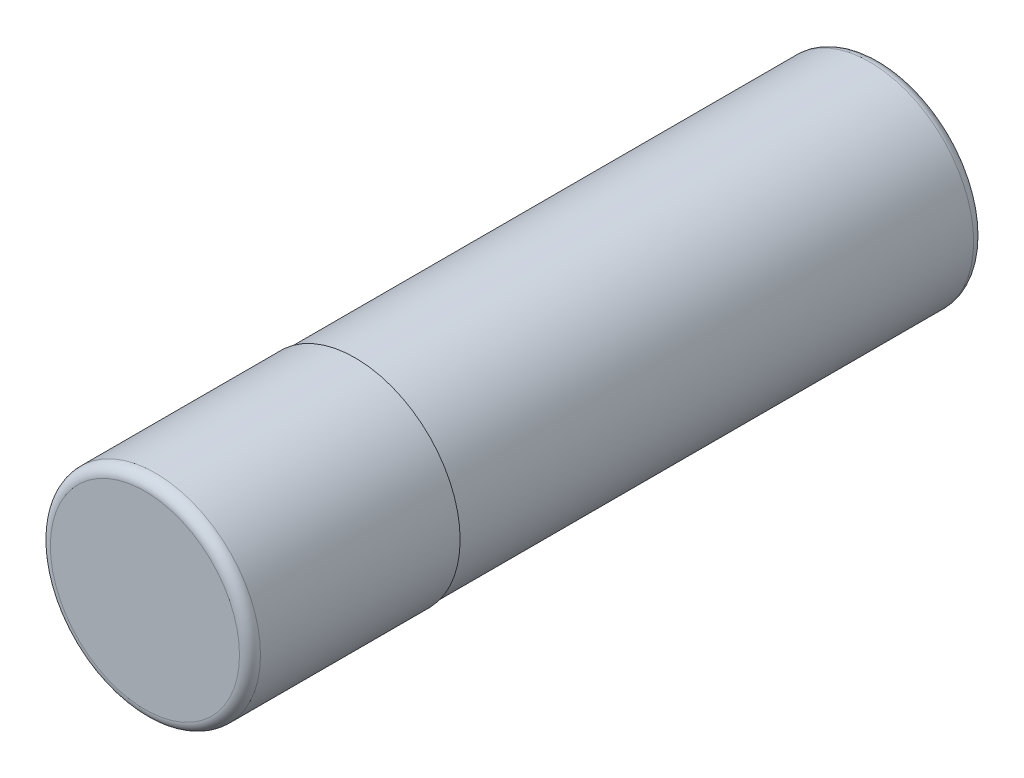
ISO-10303-21;
HEADER;
FILE_DESCRIPTION(('STEP AP214'),'2;1');
FILE_NAME('part.step','',(''),(''),'','','');
FILE_SCHEMA(('AUTOMOTIVE_DESIGN { 1 0 10303 214 1 1 1 1 }'));
ENDSEC;
DATA;
#1=APPLICATION_CONTEXT('core data for automotive mechanical design processes');
#2=APPLICATION_PROTOCOL_DEFINITION('international standard','automotive_design',2000,#1);
#3=PRODUCT_CONTEXT('',#1,'mechanical');
#4=PRODUCT('Part','Part','',(#3));
#5=PRODUCT_RELATED_PRODUCT_CATEGORY('part','',(#4));
#6=PRODUCT_DEFINITION_FORMATION('','',#4);
#7=PRODUCT_DEFINITION_CONTEXT('part definition',#1,'design');
#8=PRODUCT_DEFINITION('design','',#6,#7);
#9=PRODUCT_DEFINITION_SHAPE('','',#8);
#10=(LENGTH_UNIT() NAMED_UNIT(*) SI_UNIT(.MILLI.,.METRE.));
#11=(NAMED_UNIT(*) PLANE_ANGLE_UNIT() SI_UNIT($,.RADIAN.));
#12=(NAMED_UNIT(*) SI_UNIT($,.STERADIAN.) SOLID_ANGLE_UNIT());
#13=UNCERTAINTY_MEASURE_WITH_UNIT(LENGTH_MEASURE(1.E-05),#10,'distance_accuracy_value','');
#14=(GEOMETRIC_REPRESENTATION_CONTEXT(3) GLOBAL_UNCERTAINTY_ASSIGNED_CONTEXT((#13)) GLOBAL_UNIT_ASSIGNED_CONTEXT((#10,
#11,#12)) REPRESENTATION_CONTEXT('',''));
#15=CARTESIAN_POINT('',(0.,0.,0.));
#16=DIRECTION('',(0.,0.,1.));
#17=DIRECTION('',(1.,0.,0.));
#18=AXIS2_PLACEMENT_3D('',#15,#16,#17);
#19=CARTESIAN_POINT('',(0.,0.,10.));
#20=DIRECTION('',(0.,0.,-1.));
#21=DIRECTION('',(-1.,0.,0.));
#22=AXIS2_PLACEMENT_3D('',#19,#20,#21);
#23=CYLINDRICAL_SURFACE('',#22,1.975);
#24=CARTESIAN_POINT('',(0.,0.,0.200000000000001));
#25=DIRECTION('',(0.,0.,1.));
#26=DIRECTION('',(1.,0.,0.));
#27=AXIS2_PLACEMENT_3D('',#24,#25,#26);
#28=CIRCLE('',#27,1.975);
#29=CARTESIAN_POINT('',(1.975,0.,0.200000000000001));
#30=VERTEX_POINT('',#29);
#31=EDGE_CURVE('E47',#30,#30,#28,.T.);
#32=ORIENTED_EDGE('',*,*,#31,.T.);
#33=EDGE_LOOP('',(#32));
#34=FACE_BOUND('',#33,.T.);
#35=CARTESIAN_POINT('',(0.,0.,10.));
#36=DIRECTION('',(0.,0.,1.));
#37=DIRECTION('',(1.,0.,0.));
#38=AXIS2_PLACEMENT_3D('',#35,#36,#37);
#39=CIRCLE('',#38,1.975);
#40=CARTESIAN_POINT('',(1.975,0.,10.));
#41=VERTEX_POINT('',#40);
#42=EDGE_CURVE('E52',#41,#41,#39,.T.);
#43=ORIENTED_EDGE('',*,*,#42,.F.);
#44=EDGE_LOOP('',(#43));
#45=FACE_BOUND('',#44,.T.);
#46=ADVANCED_FACE('F32',(#34,#45),#23,.T.);
#47=CARTESIAN_POINT('',(0.,0.,0.));
#48=DIRECTION('',(0.,0.,1.));
#49=DIRECTION('',(1.,0.,0.));
#50=AXIS2_PLACEMENT_3D('',#47,#48,#49);
#51=PLANE('',#50);
#52=CARTESIAN_POINT('',(0.,0.,0.));
#53=DIRECTION('',(0.,0.,1.));
#54=DIRECTION('',(1.,0.,0.));
#55=AXIS2_PLACEMENT_3D('',#52,#53,#54);
#56=CIRCLE('',#55,1.775);
#57=CARTESIAN_POINT('',(1.775,0.,0.));
#58=VERTEX_POINT('',#57);
#59=EDGE_CURVE('E43',#58,#58,#56,.F.);
#60=ORIENTED_EDGE('',*,*,#59,.T.);
#61=EDGE_LOOP('',(#60));
#62=FACE_BOUND('',#61,.T.);
#63=ADVANCED_FACE('F74',(#62),#51,.F.);
#64=CARTESIAN_POINT('',(0.,0.,0.200000000000001));
#65=DIRECTION('',(0.,0.,1.));
#66=DIRECTION('',(1.,0.,0.));
#67=AXIS2_PLACEMENT_3D('',#64,#65,#66);
#68=TOROIDAL_SURFACE('',#67,1.775,0.2);
#69=ORIENTED_EDGE('',*,*,#59,.F.);
#70=EDGE_LOOP('',(#69));
#71=FACE_BOUND('',#70,.T.);
#72=ORIENTED_EDGE('',*,*,#31,.F.);
#73=EDGE_LOOP('',(#72));
#74=FACE_BOUND('',#73,.T.);
#75=ADVANCED_FACE('F80',(#71,#74),#68,.T.);
#76=CARTESIAN_POINT('',(0.,0.,14.));
#77=DIRECTION('',(0.,0.,-1.));
#78=DIRECTION('',(-1.,0.,0.));
#79=AXIS2_PLACEMENT_3D('',#76,#77,#78);
#80=CYLINDRICAL_SURFACE('',#79,2.);
#81=CARTESIAN_POINT('',(0.,0.,13.8));
#82=DIRECTION('',(0.,0.,1.));
#83=DIRECTION('',(1.,0.,0.));
#84=AXIS2_PLACEMENT_3D('',#81,#82,#83);
#85=CIRCLE('',#84,2.);
#86=CARTESIAN_POINT('',(2.,0.,13.8));
#87=VERTEX_POINT('',#86);
#88=EDGE_CURVE('E10',#87,#87,#85,.F.);
#89=ORIENTED_EDGE('',*,*,#88,.T.);
#90=EDGE_LOOP('',(#89));
#91=FACE_BOUND('',#90,.T.);
#92=CARTESIAN_POINT('',(0.,0.,10.));
#93=DIRECTION('',(0.,0.,1.));
#94=DIRECTION('',(1.,0.,0.));
#95=AXIS2_PLACEMENT_3D('',#92,#93,#94);
#96=CIRCLE('',#95,2.);
#97=CARTESIAN_POINT('',(2.,0.,10.));
#98=VERTEX_POINT('',#97);
#99=EDGE_CURVE('E55',#98,#98,#96,.T.);
#100=ORIENTED_EDGE('',*,*,#99,.T.);
#101=EDGE_LOOP('',(#100));
#102=FACE_BOUND('',#101,.T.);
#103=ADVANCED_FACE('F59',(#91,#102),#80,.T.);
#104=CARTESIAN_POINT('',(0.,0.,14.));
#105=DIRECTION('',(0.,0.,1.));
#106=DIRECTION('',(1.,0.,0.));
#107=AXIS2_PLACEMENT_3D('',#104,#105,#106);
#108=PLANE('',#107);
#109=CARTESIAN_POINT('',(0.,0.,14.));
#110=DIRECTION('',(0.,0.,1.));
#111=DIRECTION('',(1.,0.,0.));
#112=AXIS2_PLACEMENT_3D('',#109,#110,#111);
#113=CIRCLE('',#112,1.8);
#114=CARTESIAN_POINT('',(1.8,0.,14.));
#115=VERTEX_POINT('',#114);
#116=EDGE_CURVE('E39',#115,#115,#113,.T.);
#117=ORIENTED_EDGE('',*,*,#116,.T.);
#118=EDGE_LOOP('',(#117));
#119=FACE_BOUND('',#118,.T.);
#120=ADVANCED_FACE('F63',(#119),#108,.T.);
#121=CARTESIAN_POINT('',(0.,0.,10.));
#122=DIRECTION('',(0.,0.,1.));
#123=DIRECTION('',(1.,0.,0.));
#124=AXIS2_PLACEMENT_3D('',#121,#122,#123);
#125=PLANE('',#124);
#126=ORIENTED_EDGE('',*,*,#42,.T.);
#127=EDGE_LOOP('',(#126));
#128=FACE_BOUND('',#127,.T.);
#129=ORIENTED_EDGE('',*,*,#99,.F.);
#130=EDGE_LOOP('',(#129));
#131=FACE_BOUND('',#130,.T.);
#132=ADVANCED_FACE('F61',(#128,#131),#125,.F.);
#133=CARTESIAN_POINT('',(0.,0.,13.8));
#134=DIRECTION('',(0.,0.,1.));
#135=DIRECTION('',(1.,0.,0.));
#136=AXIS2_PLACEMENT_3D('',#133,#134,#135);
#137=TOROIDAL_SURFACE('',#136,1.8,0.2);
#138=ORIENTED_EDGE('',*,*,#88,.F.);
#139=EDGE_LOOP('',(#138));
#140=FACE_BOUND('',#139,.T.);
#141=ORIENTED_EDGE('',*,*,#116,.F.);
#142=EDGE_LOOP('',(#141));
#143=FACE_BOUND('',#142,.T.);
#144=ADVANCED_FACE('F34',(#140,#143),#137,.T.);
#145=CLOSED_SHELL('',(#46,#63,#75,#103,#120,#132,#144));
#146=MANIFOLD_SOLID_BREP('B2',#145);
#147=ADVANCED_BREP_SHAPE_REPRESENTATION('',(#18,#146),#14);
#148=SHAPE_DEFINITION_REPRESENTATION(#9,#147);
ENDSEC;
END-ISO-10303-21;
